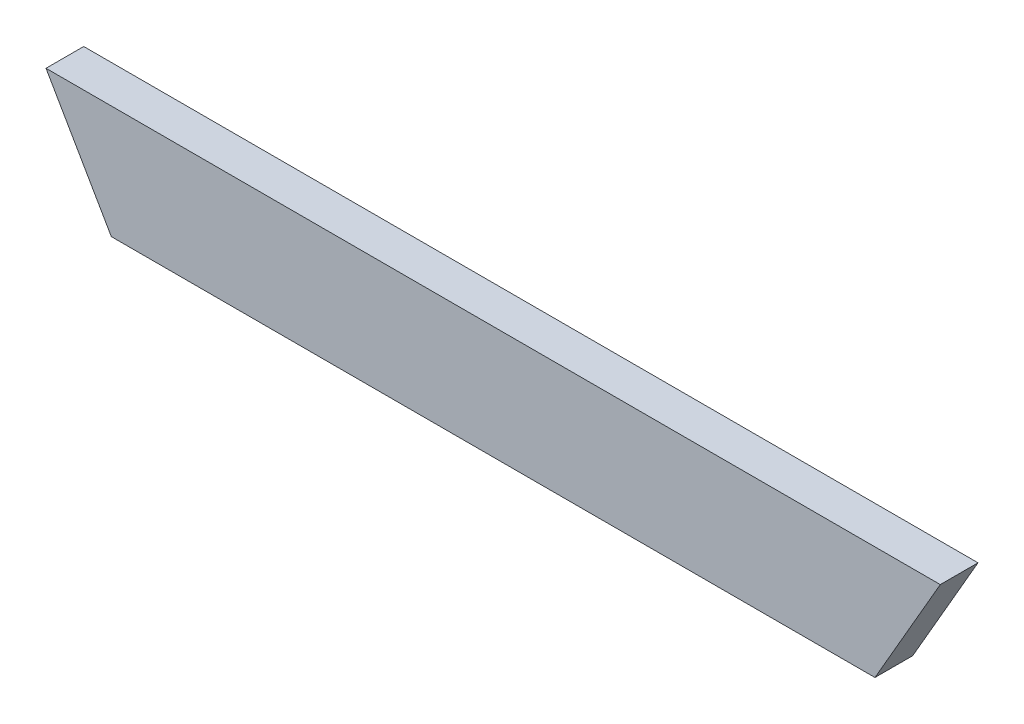
ISO-10303-21;
HEADER;
FILE_DESCRIPTION(('STEP AP214'),'2;1');
FILE_NAME('part.step','',(''),(''),'','','');
FILE_SCHEMA(('AUTOMOTIVE_DESIGN { 1 0 10303 214 1 1 1 1 }'));
ENDSEC;
DATA;
#1=APPLICATION_CONTEXT('core data for automotive mechanical design processes');
#2=APPLICATION_PROTOCOL_DEFINITION('international standard','automotive_design',2000,#1);
#3=PRODUCT_CONTEXT('',#1,'mechanical');
#4=PRODUCT('Part','Part','',(#3));
#5=PRODUCT_RELATED_PRODUCT_CATEGORY('part','',(#4));
#6=PRODUCT_DEFINITION_FORMATION('','',#4);
#7=PRODUCT_DEFINITION_CONTEXT('part definition',#1,'design');
#8=PRODUCT_DEFINITION('design','',#6,#7);
#9=PRODUCT_DEFINITION_SHAPE('','',#8);
#10=(LENGTH_UNIT() NAMED_UNIT(*) SI_UNIT(.MILLI.,.METRE.));
#11=(NAMED_UNIT(*) PLANE_ANGLE_UNIT() SI_UNIT($,.RADIAN.));
#12=(NAMED_UNIT(*) SI_UNIT($,.STERADIAN.) SOLID_ANGLE_UNIT());
#13=UNCERTAINTY_MEASURE_WITH_UNIT(LENGTH_MEASURE(1.E-05),#10,'distance_accuracy_value','');
#14=(GEOMETRIC_REPRESENTATION_CONTEXT(3) GLOBAL_UNCERTAINTY_ASSIGNED_CONTEXT((#13)) GLOBAL_UNIT_ASSIGNED_CONTEXT((#10,
#11,#12)) REPRESENTATION_CONTEXT('',''));
#15=CARTESIAN_POINT('',(0.,0.,0.));
#16=DIRECTION('',(0.,0.,1.));
#17=DIRECTION('',(1.,0.,0.));
#18=AXIS2_PLACEMENT_3D('',#15,#16,#17);
#19=CARTESIAN_POINT('',(-199.02232370725,39.1095985267382,15.));
#20=DIRECTION('',(0.86602540378444,0.499999999999998,0.));
#21=DIRECTION('',(-0.499999999999998,0.86602540378444,0.));
#22=AXIS2_PLACEMENT_3D('',#19,#20,#21);
#23=PLANE('',#22);
#24=DIRECTION('',(0.499999999999998,-0.86602540378444,0.));
#25=VECTOR('',#24,1.);
#26=CARTESIAN_POINT('',(-199.02232370725,39.1095985267382,0.));
#27=LINE('',#26,#25);
#28=CARTESIAN_POINT('',(-225.003085820783,84.1095985267383,0.));
#29=VERTEX_POINT('',#28);
#30=CARTESIAN_POINT('',(-199.02232370725,39.1095985267382,0.));
#31=VERTEX_POINT('',#30);
#32=EDGE_CURVE('E96',#29,#31,#27,.T.);
#33=ORIENTED_EDGE('',*,*,#32,.T.);
#34=DIRECTION('',(0.,0.,-1.));
#35=VECTOR('',#34,1.);
#36=CARTESIAN_POINT('',(-199.02232370725,39.1095985267382,15.));
#37=LINE('',#36,#35);
#38=CARTESIAN_POINT('',(-199.02232370725,39.1095985267382,15.));
#39=VERTEX_POINT('',#38);
#40=EDGE_CURVE('E11',#39,#31,#37,.T.);
#41=ORIENTED_EDGE('',*,*,#40,.F.);
#42=DIRECTION('',(0.499999999999998,-0.86602540378444,0.));
#43=VECTOR('',#42,1.);
#44=CARTESIAN_POINT('',(-199.02232370725,39.1095985267382,15.));
#45=LINE('',#44,#43);
#46=CARTESIAN_POINT('',(-225.003085820783,84.1095985267383,15.));
#47=VERTEX_POINT('',#46);
#48=EDGE_CURVE('E84',#47,#39,#45,.T.);
#49=ORIENTED_EDGE('',*,*,#48,.F.);
#50=DIRECTION('',(0.,0.,-1.));
#51=VECTOR('',#50,1.);
#52=CARTESIAN_POINT('',(-225.003085820783,84.1095985267383,15.));
#53=LINE('',#52,#51);
#54=EDGE_CURVE('E92',#47,#29,#53,.T.);
#55=ORIENTED_EDGE('',*,*,#54,.T.);
#56=EDGE_LOOP('',(#33,#41,#49,#55));
#57=FACE_BOUND('',#56,.T.);
#58=ADVANCED_FACE('F33',(#57),#23,.F.);
#59=CARTESIAN_POINT('',(104.676152065684,39.1095985267383,15.));
#60=DIRECTION('',(0.,1.,0.));
#61=DIRECTION('',(-1.,0.,0.));
#62=AXIS2_PLACEMENT_3D('',#59,#60,#61);
#63=PLANE('',#62);
#64=DIRECTION('',(1.,0.,0.));
#65=VECTOR('',#64,1.);
#66=CARTESIAN_POINT('',(104.676152065684,39.1095985267383,0.));
#67=LINE('',#66,#65);
#68=CARTESIAN_POINT('',(104.676152065684,39.1095985267383,0.));
#69=VERTEX_POINT('',#68);
#70=EDGE_CURVE('E88',#31,#69,#67,.T.);
#71=ORIENTED_EDGE('',*,*,#70,.T.);
#72=DIRECTION('',(0.,0.,-1.));
#73=VECTOR('',#72,1.);
#74=CARTESIAN_POINT('',(104.676152065684,39.1095985267383,15.));
#75=LINE('',#74,#73);
#76=CARTESIAN_POINT('',(104.676152065684,39.1095985267383,15.));
#77=VERTEX_POINT('',#76);
#78=EDGE_CURVE('E41',#77,#69,#75,.T.);
#79=ORIENTED_EDGE('',*,*,#78,.F.);
#80=DIRECTION('',(1.,0.,0.));
#81=VECTOR('',#80,1.);
#82=CARTESIAN_POINT('',(104.676152065684,39.1095985267383,15.));
#83=LINE('',#82,#81);
#84=EDGE_CURVE('E79',#39,#77,#83,.T.);
#85=ORIENTED_EDGE('',*,*,#84,.F.);
#86=ORIENTED_EDGE('',*,*,#40,.T.);
#87=EDGE_LOOP('',(#71,#79,#85,#86));
#88=FACE_BOUND('',#87,.T.);
#89=ADVANCED_FACE('F87',(#88),#63,.F.);
#90=CARTESIAN_POINT('',(130.656914179217,84.1095985267383,15.));
#91=DIRECTION('',(-0.866025403784439,0.5,0.));
#92=DIRECTION('',(-0.5,-0.866025403784439,0.));
#93=AXIS2_PLACEMENT_3D('',#90,#91,#92);
#94=PLANE('',#93);
#95=DIRECTION('',(0.5,0.866025403784439,0.));
#96=VECTOR('',#95,1.);
#97=CARTESIAN_POINT('',(130.656914179217,84.1095985267383,0.));
#98=LINE('',#97,#96);
#99=CARTESIAN_POINT('',(130.656914179217,84.1095985267383,0.));
#100=VERTEX_POINT('',#99);
#101=EDGE_CURVE('E66',#69,#100,#98,.T.);
#102=ORIENTED_EDGE('',*,*,#101,.T.);
#103=DIRECTION('',(0.,0.,-1.));
#104=VECTOR('',#103,1.);
#105=CARTESIAN_POINT('',(130.656914179217,84.1095985267383,15.));
#106=LINE('',#105,#104);
#107=CARTESIAN_POINT('',(130.656914179217,84.1095985267383,15.));
#108=VERTEX_POINT('',#107);
#109=EDGE_CURVE('E89',#108,#100,#106,.T.);
#110=ORIENTED_EDGE('',*,*,#109,.F.);
#111=DIRECTION('',(0.5,0.866025403784439,0.));
#112=VECTOR('',#111,1.);
#113=CARTESIAN_POINT('',(130.656914179217,84.1095985267383,15.));
#114=LINE('',#113,#112);
#115=EDGE_CURVE('E82',#77,#108,#114,.T.);
#116=ORIENTED_EDGE('',*,*,#115,.F.);
#117=ORIENTED_EDGE('',*,*,#78,.T.);
#118=EDGE_LOOP('',(#102,#110,#116,#117));
#119=FACE_BOUND('',#118,.T.);
#120=ADVANCED_FACE('F90',(#119),#94,.F.);
#121=CARTESIAN_POINT('',(-225.003085820783,84.1095985267383,15.));
#122=DIRECTION('',(0.,-1.,0.));
#123=DIRECTION('',(0.,0.,-1.));
#124=AXIS2_PLACEMENT_3D('',#121,#122,#123);
#125=PLANE('',#124);
#126=DIRECTION('',(-1.,0.,0.));
#127=VECTOR('',#126,1.);
#128=CARTESIAN_POINT('',(-225.003085820783,84.1095985267383,0.));
#129=LINE('',#128,#127);
#130=EDGE_CURVE('E72',#100,#29,#129,.T.);
#131=ORIENTED_EDGE('',*,*,#130,.T.);
#132=ORIENTED_EDGE('',*,*,#54,.F.);
#133=DIRECTION('',(-1.,0.,0.));
#134=VECTOR('',#133,1.);
#135=CARTESIAN_POINT('',(-225.003085820783,84.1095985267383,15.));
#136=LINE('',#135,#134);
#137=EDGE_CURVE('E49',#108,#47,#136,.T.);
#138=ORIENTED_EDGE('',*,*,#137,.F.);
#139=ORIENTED_EDGE('',*,*,#109,.T.);
#140=EDGE_LOOP('',(#131,#132,#138,#139));
#141=FACE_BOUND('',#140,.T.);
#142=ADVANCED_FACE('F103',(#141),#125,.F.);
#143=CARTESIAN_POINT('',(0.,0.,15.));
#144=DIRECTION('',(0.,0.,-1.));
#145=DIRECTION('',(-1.,0.,0.));
#146=AXIS2_PLACEMENT_3D('',#143,#144,#145);
#147=PLANE('',#146);
#148=ORIENTED_EDGE('',*,*,#48,.T.);
#149=ORIENTED_EDGE('',*,*,#84,.T.);
#150=ORIENTED_EDGE('',*,*,#115,.T.);
#151=ORIENTED_EDGE('',*,*,#137,.T.);
#152=EDGE_LOOP('',(#148,#149,#150,#151));
#153=FACE_BOUND('',#152,.T.);
#154=ADVANCED_FACE('F80',(#153),#147,.F.);
#155=CARTESIAN_POINT('',(0.,0.,0.));
#156=DIRECTION('',(0.,0.,-1.));
#157=DIRECTION('',(-1.,0.,0.));
#158=AXIS2_PLACEMENT_3D('',#155,#156,#157);
#159=PLANE('',#158);
#160=ORIENTED_EDGE('',*,*,#32,.F.);
#161=ORIENTED_EDGE('',*,*,#130,.F.);
#162=ORIENTED_EDGE('',*,*,#101,.F.);
#163=ORIENTED_EDGE('',*,*,#70,.F.);
#164=EDGE_LOOP('',(#160,#161,#162,#163));
#165=FACE_BOUND('',#164,.T.);
#166=ADVANCED_FACE('F106',(#165),#159,.T.);
#167=CLOSED_SHELL('',(#58,#89,#120,#142,#154,#166));
#168=MANIFOLD_SOLID_BREP('B2',#167);
#169=ADVANCED_BREP_SHAPE_REPRESENTATION('',(#18,#168),#14);
#170=SHAPE_DEFINITION_REPRESENTATION(#9,#169);
ENDSEC;
END-ISO-10303-21;
